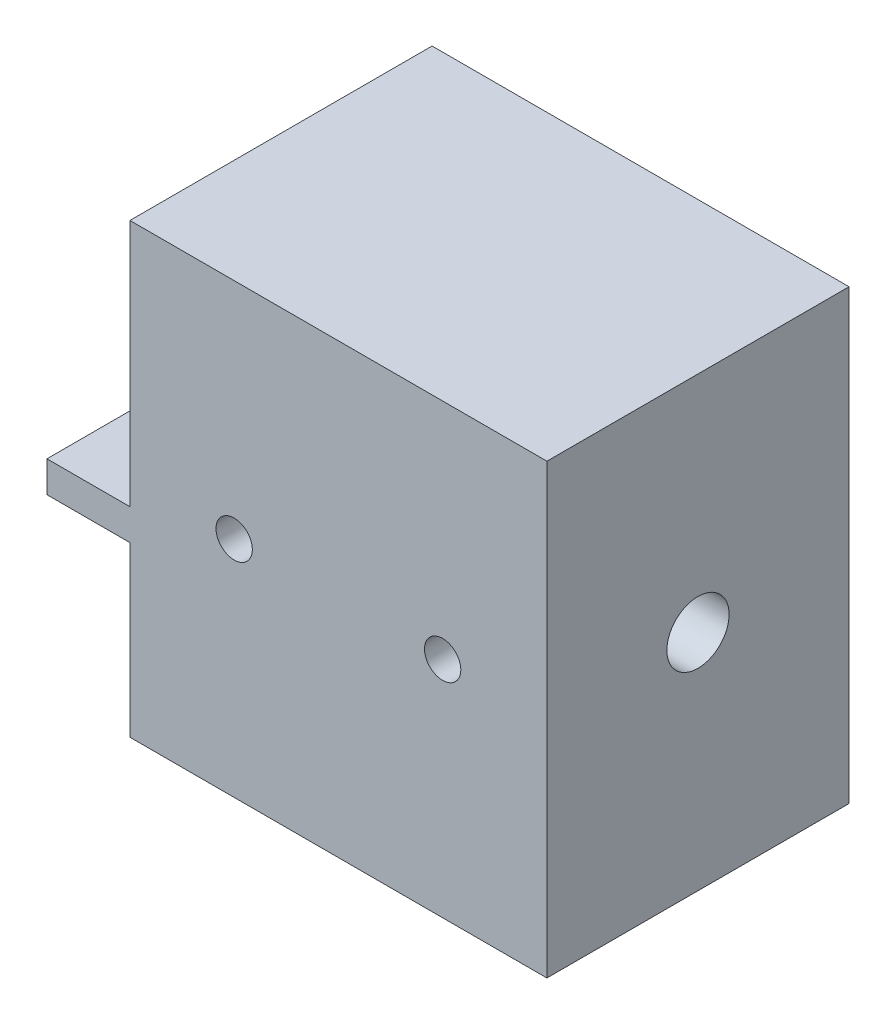
ISO-10303-21;
HEADER;
FILE_DESCRIPTION(('STEP AP214'),'2;1');
FILE_NAME('part.step','',(''),(''),'','','');
FILE_SCHEMA(('AUTOMOTIVE_DESIGN { 1 0 10303 214 1 1 1 1 }'));
ENDSEC;
DATA;
#1=APPLICATION_CONTEXT('core data for automotive mechanical design processes');
#2=APPLICATION_PROTOCOL_DEFINITION('international standard','automotive_design',2000,#1);
#3=PRODUCT_CONTEXT('',#1,'mechanical');
#4=PRODUCT('Part','Part','',(#3));
#5=PRODUCT_RELATED_PRODUCT_CATEGORY('part','',(#4));
#6=PRODUCT_DEFINITION_FORMATION('','',#4);
#7=PRODUCT_DEFINITION_CONTEXT('part definition',#1,'design');
#8=PRODUCT_DEFINITION('design','',#6,#7);
#9=PRODUCT_DEFINITION_SHAPE('','',#8);
#10=(LENGTH_UNIT() NAMED_UNIT(*) SI_UNIT(.MILLI.,.METRE.));
#11=(NAMED_UNIT(*) PLANE_ANGLE_UNIT() SI_UNIT($,.RADIAN.));
#12=(NAMED_UNIT(*) SI_UNIT($,.STERADIAN.) SOLID_ANGLE_UNIT());
#13=UNCERTAINTY_MEASURE_WITH_UNIT(LENGTH_MEASURE(1.E-05),#10,'distance_accuracy_value','');
#14=(GEOMETRIC_REPRESENTATION_CONTEXT(3) GLOBAL_UNCERTAINTY_ASSIGNED_CONTEXT((#13)) GLOBAL_UNIT_ASSIGNED_CONTEXT((#10,
#11,#12)) REPRESENTATION_CONTEXT('',''));
#15=CARTESIAN_POINT('',(0.,0.,0.));
#16=DIRECTION('',(0.,0.,1.));
#17=DIRECTION('',(1.,0.,0.));
#18=AXIS2_PLACEMENT_3D('',#15,#16,#17);
#19=CARTESIAN_POINT('',(-20.2513258729689,-3.79382158288662,40.));
#20=DIRECTION('',(0.,0.,-1.));
#21=DIRECTION('',(-1.,0.,0.));
#22=AXIS2_PLACEMENT_3D('',#19,#20,#21);
#23=CYLINDRICAL_SURFACE('',#22,1.75);
#24=CARTESIAN_POINT('',(-22.0013258729689,-3.79382158288662,17.565));
#25=CARTESIAN_POINT('',(-22.0013183626937,-3.70389548854153,17.5649933872255));
#26=CARTESIAN_POINT('',(-21.9943457467941,-3.61382268913705,17.5609117012381));
#27=CARTESIAN_POINT('',(-21.9667911022894,-3.43634397442441,17.5449664134664));
#28=CARTESIAN_POINT('',(-21.9461710140557,-3.34894623441761,17.5330810497795));
#29=CARTESIAN_POINT('',(-21.8924558415673,-3.17979643136016,17.5027406464476));
#30=CARTESIAN_POINT('',(-21.8594223363226,-3.09801881936906,17.4843180606085));
#31=CARTESIAN_POINT('',(-21.7821825678001,-2.94140825530694,17.4424937293754));
#32=CARTESIAN_POINT('',(-21.7379801197889,-2.86657294368377,17.4190936846924));
#33=CARTESIAN_POINT('',(-21.6359996827864,-2.71969163422893,17.3672756875161));
#34=CARTESIAN_POINT('',(-21.5774586617031,-2.6482628196938,17.3386144392163));
#35=CARTESIAN_POINT('',(-21.4501594531351,-2.51563430677802,17.2800516255849));
#36=CARTESIAN_POINT('',(-21.3813886115838,-2.45444747961298,17.2501485576482));
#37=CARTESIAN_POINT('',(-21.2262967337761,-2.33695802149655,17.1884392980714));
#38=CARTESIAN_POINT('',(-21.1388680239773,-2.2820145012298,17.1568066326621));
#39=CARTESIAN_POINT('',(-20.954164879168,-2.18782689232331,17.0995285160236));
#40=CARTESIAN_POINT('',(-20.8569061717603,-2.14855820768509,17.073873711244));
#41=CARTESIAN_POINT('',(-20.6781372003876,-2.09472359462168,17.0376236141756));
#42=CARTESIAN_POINT('',(-20.5981397467459,-2.07655565081224,17.0249229052408));
#43=CARTESIAN_POINT('',(-20.435581260063,-2.05161277481891,17.0073249974287));
#44=CARTESIAN_POINT('',(-20.3530232588854,-2.04482485581487,17.0024189037159));
#45=CARTESIAN_POINT('',(-20.1875797043464,-2.04302406953093,17.0011260357617));
#46=CARTESIAN_POINT('',(-20.1046938386221,-2.04802999095575,17.0047528552464));
#47=CARTESIAN_POINT('',(-19.9411678397311,-2.06954936453236,17.0200052736622));
#48=CARTESIAN_POINT('',(-19.8605293556819,-2.08607104709484,17.0316365934012));
#49=CARTESIAN_POINT('',(-19.7040809448141,-2.12961742036668,17.0612175952486));
#50=CARTESIAN_POINT('',(-19.6282398502999,-2.15656392084237,17.0791201483003));
#51=CARTESIAN_POINT('',(-19.4819334519636,-2.22000406830523,17.1193111884002));
#52=CARTESIAN_POINT('',(-19.4114701830917,-2.25650130634936,17.1416013243873));
#53=CARTESIAN_POINT('',(-19.2654667250514,-2.34501771576064,17.1925433945987));
#54=CARTESIAN_POINT('',(-19.1910328003616,-2.39860916799226,17.2216367408265));
#55=CARTESIAN_POINT('',(-19.0514767875005,-2.51662732207101,17.2803500964328));
#56=CARTESIAN_POINT('',(-18.9863631555545,-2.5810637496061,17.3099705570098));
#57=CARTESIAN_POINT('',(-18.8591420122246,-2.72848820539636,17.3707397511775));
#58=CARTESIAN_POINT('',(-18.7984089854912,-2.81278592986353,17.4016223828585));
#59=CARTESIAN_POINT('',(-18.6921941873567,-2.99228510060747,17.4574645083812));
#60=CARTESIAN_POINT('',(-18.6467032942154,-3.08747997948732,17.4824275422154));
#61=CARTESIAN_POINT('',(-18.5756733536579,-3.27957048061514,17.5221107689339));
#62=CARTESIAN_POINT('',(-18.5490006807076,-3.3759237159379,17.5374057010199));
#63=CARTESIAN_POINT('',(-18.5124720307535,-3.57274612460127,17.5584733765518));
#64=CARTESIAN_POINT('',(-18.5025980505962,-3.67321077330195,17.5642563137785));
#65=CARTESIAN_POINT('',(-18.5004306534122,-3.86153898687755,17.5655235952691));
#66=CARTESIAN_POINT('',(-18.5060593050292,-3.94937866575032,17.5622251989739));
#67=CARTESIAN_POINT('',(-18.5302705076321,-4.1226323922867,17.5481918220535));
#68=CARTESIAN_POINT('',(-18.5488531015192,-4.20804643191605,17.5374568167996));
#69=CARTESIAN_POINT('',(-18.5976931295868,-4.37285267497571,17.5097590850985));
#70=CARTESIAN_POINT('',(-18.6277619775221,-4.4523185608919,17.4928971606239));
#71=CARTESIAN_POINT('',(-18.698452563017,-4.60510237145512,17.4542974657267));
#72=CARTESIAN_POINT('',(-18.7390766399567,-4.6784189284409,17.4325586145653));
#73=CARTESIAN_POINT('',(-18.8344792536537,-4.8250721306599,17.3833525181235));
#74=CARTESIAN_POINT('',(-18.8902921633299,-4.89761332085752,17.355524289024));
#75=CARTESIAN_POINT('',(-19.0121404169972,-5.0328615325797,17.2981646699408));
#76=CARTESIAN_POINT('',(-19.0781876429376,-5.09555695070533,17.2686313256608));
#77=CARTESIAN_POINT('',(-19.227886433583,-5.21700189672075,17.2069174771264));
#78=CARTESIAN_POINT('',(-19.3126985709457,-5.27438432340992,17.1748424416357));
#79=CARTESIAN_POINT('',(-19.4923762338597,-5.37401570958307,17.1157551381831));
#80=CARTESIAN_POINT('',(-19.5872291749374,-5.41628332861077,17.0887366475998));
#81=CARTESIAN_POINT('',(-19.7635997704352,-5.47647872729611,17.0488837200922));
#82=CARTESIAN_POINT('',(-19.8435869804912,-5.49768864664623,17.0342474384314));
#83=CARTESIAN_POINT('',(-20.0067213412616,-5.52862404379347,17.0126165899701));
#84=CARTESIAN_POINT('',(-20.0898644273054,-5.53836380917637,17.0056125170641));
#85=CARTESIAN_POINT('',(-20.2572024805354,-5.54581956072869,17.0002675698696));
#86=CARTESIAN_POINT('',(-20.341399667315,-5.54350329863497,17.0019499305343));
#87=CARTESIAN_POINT('',(-20.5080197921451,-5.52691924033421,17.0137688322061));
#88=CARTESIAN_POINT('',(-20.5904416175361,-5.5126441606771,17.0239105253054));
#89=CARTESIAN_POINT('',(-20.7489065130706,-5.47351993257515,17.0507893341496));
#90=CARTESIAN_POINT('',(-20.8250658341734,-5.44899368585422,17.0673239766944));
#91=CARTESIAN_POINT('',(-20.9723253064089,-5.39036439758088,17.1051307925281));
#92=CARTESIAN_POINT('',(-21.0434235292089,-5.35625773000641,17.1264047589365));
#93=CARTESIAN_POINT('',(-21.1903034280437,-5.27334629678285,17.1752990399417));
#94=CARTESIAN_POINT('',(-21.2651039380693,-5.22308298443128,17.203391946195));
#95=CARTESIAN_POINT('',(-21.40593654458,-5.11193898700561,17.26064120997));
#96=CARTESIAN_POINT('',(-21.4719616971431,-5.05104998092453,17.2897983866669));
#97=CARTESIAN_POINT('',(-21.6028135990764,-4.9102688490897,17.3507153224179));
#98=CARTESIAN_POINT('',(-21.6661752534467,-4.82890939270424,17.3822670507882));
#99=CARTESIAN_POINT('',(-21.7783004603993,-4.65495943006557,17.4402129249764));
#100=CARTESIAN_POINT('',(-21.8270605884444,-4.56236629629008,17.4666058603848));
#101=CARTESIAN_POINT('',(-21.9058248845175,-4.3727258699512,17.5101375099232));
#102=CARTESIAN_POINT('',(-21.9366089901447,-4.2760981674327,17.5276557940663));
#103=CARTESIAN_POINT('',(-21.9699419473983,-4.12764789489271,17.5467893589844));
#104=CARTESIAN_POINT('',(-21.9789094958568,-4.07763805411014,17.551974732725));
#105=CARTESIAN_POINT('',(-21.992468354211,-3.97684473212933,17.5598360960392));
#106=CARTESIAN_POINT('',(-21.9970632722113,-3.9260619239706,17.5625141545109));
#107=CARTESIAN_POINT('',(-22.0006962291764,-3.84807785229347,17.5646329533989));
#108=CARTESIAN_POINT('',(-22.0013281391622,-3.82095639637275,17.5650019953764));
#109=CARTESIAN_POINT('',(-22.0013258729689,-3.79382158288662,17.565));
#110=B_SPLINE_CURVE_WITH_KNOTS('',3,(#24,#25,#26,#27,#28,#29,#30,#31,#32,#33,#34,#35,#36,#37,
#38,#39,#40,#41,#42,#43,#44,#45,#46,#47,#48,#49,#50,#51,#52,#53,#54,#55,#56,#57,#58,#59,#60,#61,
#62,#63,#64,#65,#66,#67,#68,#69,#70,#71,#72,#73,#74,#75,#76,#77,#78,#79,#80,#81,#82,#83,#84,#85,
#86,#87,#88,#89,#90,#91,#92,#93,#94,#95,#96,#97,#98,#99,#100,#101,#102,#103,#104,#105,#106,#107,
#108,#109),.UNSPECIFIED.,.T.,.F.,(4,2,2,2,2,2,2,2,2,2,2,2,2,2,2,2,2,2,2,2,2,2,2,2,2,2,2,2,2,2,2,
2,2,2,2,2,2,2,2,2,2,2,4),(0.,0.269682848507375,0.540120966746718,0.80923486744578,
1.07825696388483,1.36720562389127,1.65651472601918,1.97891442487774,2.30080622610211,
2.54877444581717,2.79645949249157,3.04453939165374,3.29279677764287,3.53922714819382,
3.78575030950588,4.07329505075291,4.36109904743875,4.6845988301423,5.00790466534685,
5.30952425878852,5.61082040251298,5.87376281934726,6.13670610700591,6.39550593899182,
6.65436317839365,6.94021883480414,7.22640888861097,7.54680260063234,7.86679940325803,
8.11784613873921,8.36857983060695,8.61998454570948,8.87154248884004,9.11571156496425,
9.35997317962994,9.64208079618313,9.92441033147707,10.246312237478,10.5682895810184,
10.8749947772205,11.0280026433254,11.1808841442313,11.26225978773),.UNSPECIFIED.);
#111=CARTESIAN_POINT('',(-22.0013258729689,-3.79382158288662,17.565));
#112=VERTEX_POINT('',#111);
#113=EDGE_CURVE('E36',#112,#112,#110,.T.);
#114=ORIENTED_EDGE('',*,*,#113,.T.);
#115=EDGE_LOOP('',(#114));
#116=FACE_BOUND('',#115,.T.);
#117=CARTESIAN_POINT('',(-20.2513258729689,-3.79382158288662,29.13));
#118=DIRECTION('',(0.,0.,1.));
#119=DIRECTION('',(1.,0.,0.));
#120=AXIS2_PLACEMENT_3D('',#117,#118,#119);
#121=CIRCLE('',#120,1.75);
#122=CARTESIAN_POINT('',(-18.5013258729689,-3.79382158288662,29.13));
#123=VERTEX_POINT('',#122);
#124=EDGE_CURVE('E206',#123,#123,#121,.T.);
#125=ORIENTED_EDGE('',*,*,#124,.T.);
#126=EDGE_LOOP('',(#125));
#127=FACE_BOUND('',#126,.T.);
#128=ADVANCED_FACE('F32',(#116,#127),#23,.F.);
#129=CARTESIAN_POINT('',(-50.4013258729689,17.7811784171134,29.13));
#130=DIRECTION('',(1.,0.,0.));
#131=DIRECTION('',(0.,0.,-1.));
#132=AXIS2_PLACEMENT_3D('',#129,#130,#131);
#133=PLANE('',#132);
#134=DIRECTION('',(0.,0.,1.));
#135=VECTOR('',#134,1.);
#136=CARTESIAN_POINT('',(-50.4013258729689,-9.11882158288662,29.13));
#137=LINE('',#136,#135);
#138=CARTESIAN_POINT('',(-50.4013258729689,-9.11882158288662,0.));
#139=VERTEX_POINT('',#138);
#140=CARTESIAN_POINT('',(-50.4013258729689,-9.11882158288662,29.13));
#141=VERTEX_POINT('',#140);
#142=EDGE_CURVE('E125',#139,#141,#137,.T.);
#143=ORIENTED_EDGE('',*,*,#142,.F.);
#144=DIRECTION('',(0.,-1.,0.));
#145=VECTOR('',#144,1.);
#146=CARTESIAN_POINT('',(-50.4013258729689,17.7811784171134,0.));
#147=LINE('',#146,#145);
#148=CARTESIAN_POINT('',(-50.4013258729689,-25.3688215828866,0.));
#149=VERTEX_POINT('',#148);
#150=EDGE_CURVE('E126',#139,#149,#147,.T.);
#151=ORIENTED_EDGE('',*,*,#150,.T.);
#152=DIRECTION('',(0.,0.,-1.));
#153=VECTOR('',#152,1.);
#154=CARTESIAN_POINT('',(-50.4013258729689,-25.3688215828866,29.13));
#155=LINE('',#154,#153);
#156=CARTESIAN_POINT('',(-50.4013258729689,-25.3688215828866,29.13));
#157=VERTEX_POINT('',#156);
#158=EDGE_CURVE('E11',#157,#149,#155,.T.);
#159=ORIENTED_EDGE('',*,*,#158,.F.);
#160=DIRECTION('',(0.,-1.,0.));
#161=VECTOR('',#160,1.);
#162=CARTESIAN_POINT('',(-50.4013258729689,17.7811784171134,29.13));
#163=LINE('',#162,#161);
#164=EDGE_CURVE('E53',#141,#157,#163,.T.);
#165=ORIENTED_EDGE('',*,*,#164,.F.);
#166=EDGE_LOOP('',(#143,#151,#159,#165));
#167=FACE_BOUND('',#166,.T.);
#168=ADVANCED_FACE('F34',(#167),#133,.F.);
#169=DIRECTION('',(0.,0.,-1.));
#170=VECTOR('',#169,1.);
#171=CARTESIAN_POINT('',(-50.4013258729689,-6.11882158288662,0.));
#172=LINE('',#171,#170);
#173=CARTESIAN_POINT('',(-50.4013258729689,-6.11882158288662,29.13));
#174=VERTEX_POINT('',#173);
#175=CARTESIAN_POINT('',(-50.4013258729689,-6.11882158288662,0.));
#176=VERTEX_POINT('',#175);
#177=EDGE_CURVE('E61',#174,#176,#172,.T.);
#178=ORIENTED_EDGE('',*,*,#177,.F.);
#179=CARTESIAN_POINT('',(-50.4013258729689,17.7811784171134,29.13));
#180=VERTEX_POINT('',#179);
#181=EDGE_CURVE('E134',#180,#174,#163,.T.);
#182=ORIENTED_EDGE('',*,*,#181,.F.);
#183=DIRECTION('',(0.,0.,-1.));
#184=VECTOR('',#183,1.);
#185=CARTESIAN_POINT('',(-50.4013258729689,17.7811784171134,29.13));
#186=LINE('',#185,#184);
#187=CARTESIAN_POINT('',(-50.4013258729689,17.7811784171134,0.));
#188=VERTEX_POINT('',#187);
#189=EDGE_CURVE('E141',#180,#188,#186,.T.);
#190=ORIENTED_EDGE('',*,*,#189,.T.);
#191=EDGE_CURVE('E128',#188,#176,#147,.T.);
#192=ORIENTED_EDGE('',*,*,#191,.T.);
#193=EDGE_LOOP('',(#178,#182,#190,#192));
#194=FACE_BOUND('',#193,.T.);
#195=ADVANCED_FACE('F189',(#194),#133,.F.);
#196=CARTESIAN_POINT('',(-50.4013258729689,-25.3688215828866,29.13));
#197=DIRECTION('',(0.,1.,0.));
#198=DIRECTION('',(0.,0.,1.));
#199=AXIS2_PLACEMENT_3D('',#196,#197,#198);
#200=PLANE('',#199);
#201=DIRECTION('',(1.,0.,0.));
#202=VECTOR('',#201,1.);
#203=CARTESIAN_POINT('',(-50.4013258729689,-25.3688215828866,0.));
#204=LINE('',#203,#202);
#205=CARTESIAN_POINT('',(-10.2013258729689,-25.3688215828866,0.));
#206=VERTEX_POINT('',#205);
#207=EDGE_CURVE('E143',#149,#206,#204,.T.);
#208=ORIENTED_EDGE('',*,*,#207,.T.);
#209=DIRECTION('',(0.,0.,-1.));
#210=VECTOR('',#209,1.);
#211=CARTESIAN_POINT('',(-10.2013258729689,-25.3688215828866,29.13));
#212=LINE('',#211,#210);
#213=CARTESIAN_POINT('',(-10.2013258729689,-25.3688215828866,29.13));
#214=VERTEX_POINT('',#213);
#215=EDGE_CURVE('E45',#214,#206,#212,.T.);
#216=ORIENTED_EDGE('',*,*,#215,.F.);
#217=DIRECTION('',(1.,0.,0.));
#218=VECTOR('',#217,1.);
#219=CARTESIAN_POINT('',(-50.4013258729689,-25.3688215828866,29.13));
#220=LINE('',#219,#218);
#221=EDGE_CURVE('E136',#157,#214,#220,.T.);
#222=ORIENTED_EDGE('',*,*,#221,.F.);
#223=ORIENTED_EDGE('',*,*,#158,.T.);
#224=EDGE_LOOP('',(#208,#216,#222,#223));
#225=FACE_BOUND('',#224,.T.);
#226=ADVANCED_FACE('F262',(#225),#200,.F.);
#227=CARTESIAN_POINT('',(-10.2013258729689,17.7811784171134,29.13));
#228=DIRECTION('',(-1.,0.,0.));
#229=DIRECTION('',(0.,0.,1.));
#230=AXIS2_PLACEMENT_3D('',#227,#228,#229);
#231=PLANE('',#230);
#232=CARTESIAN_POINT('',(-10.2013258729689,-3.79382158288662,14.565));
#233=DIRECTION('',(1.,0.,0.));
#234=DIRECTION('',(0.,0.,-1.));
#235=AXIS2_PLACEMENT_3D('',#232,#233,#234);
#236=CIRCLE('',#235,3.);
#237=CARTESIAN_POINT('',(-10.2013258729689,-3.79382158288662,11.565));
#238=VERTEX_POINT('',#237);
#239=EDGE_CURVE('E212',#238,#238,#236,.T.);
#240=ORIENTED_EDGE('',*,*,#239,.F.);
#241=EDGE_LOOP('',(#240));
#242=FACE_BOUND('',#241,.T.);
#243=DIRECTION('',(0.,1.,0.));
#244=VECTOR('',#243,1.);
#245=CARTESIAN_POINT('',(-10.2013258729689,17.7811784171134,0.));
#246=LINE('',#245,#244);
#247=CARTESIAN_POINT('',(-10.2013258729689,17.7811784171134,0.));
#248=VERTEX_POINT('',#247);
#249=EDGE_CURVE('E145',#206,#248,#246,.T.);
#250=ORIENTED_EDGE('',*,*,#249,.T.);
#251=DIRECTION('',(0.,0.,-1.));
#252=VECTOR('',#251,1.);
#253=CARTESIAN_POINT('',(-10.2013258729689,17.7811784171134,29.13));
#254=LINE('',#253,#252);
#255=CARTESIAN_POINT('',(-10.2013258729689,17.7811784171134,29.13));
#256=VERTEX_POINT('',#255);
#257=EDGE_CURVE('E151',#256,#248,#254,.T.);
#258=ORIENTED_EDGE('',*,*,#257,.F.);
#259=DIRECTION('',(0.,1.,0.));
#260=VECTOR('',#259,1.);
#261=CARTESIAN_POINT('',(-10.2013258729689,17.7811784171134,29.13));
#262=LINE('',#261,#260);
#263=EDGE_CURVE('E138',#214,#256,#262,.T.);
#264=ORIENTED_EDGE('',*,*,#263,.F.);
#265=ORIENTED_EDGE('',*,*,#215,.T.);
#266=EDGE_LOOP('',(#250,#258,#264,#265));
#267=FACE_BOUND('',#266,.T.);
#268=ADVANCED_FACE('F259',(#242,#267),#231,.F.);
#269=CARTESIAN_POINT('',(-50.4013258729689,17.7811784171134,29.13));
#270=DIRECTION('',(0.,-1.,0.));
#271=DIRECTION('',(0.,0.,-1.));
#272=AXIS2_PLACEMENT_3D('',#269,#270,#271);
#273=PLANE('',#272);
#274=DIRECTION('',(-1.,0.,0.));
#275=VECTOR('',#274,1.);
#276=CARTESIAN_POINT('',(-50.4013258729689,17.7811784171134,0.));
#277=LINE('',#276,#275);
#278=EDGE_CURVE('E147',#248,#188,#277,.T.);
#279=ORIENTED_EDGE('',*,*,#278,.T.);
#280=ORIENTED_EDGE('',*,*,#189,.F.);
#281=DIRECTION('',(-1.,0.,0.));
#282=VECTOR('',#281,1.);
#283=CARTESIAN_POINT('',(-50.4013258729689,17.7811784171134,29.13));
#284=LINE('',#283,#282);
#285=EDGE_CURVE('E140',#256,#180,#284,.T.);
#286=ORIENTED_EDGE('',*,*,#285,.F.);
#287=ORIENTED_EDGE('',*,*,#257,.T.);
#288=EDGE_LOOP('',(#279,#280,#286,#287));
#289=FACE_BOUND('',#288,.T.);
#290=ADVANCED_FACE('F253',(#289),#273,.F.);
#291=CARTESIAN_POINT('',(0.,0.,29.13));
#292=DIRECTION('',(0.,0.,1.));
#293=DIRECTION('',(1.,0.,0.));
#294=AXIS2_PLACEMENT_3D('',#291,#292,#293);
#295=PLANE('',#294);
#296=ORIENTED_EDGE('',*,*,#124,.F.);
#297=EDGE_LOOP('',(#296));
#298=FACE_BOUND('',#297,.T.);
#299=CARTESIAN_POINT('',(-40.3513258729689,-3.79382158288662,29.13));
#300=DIRECTION('',(0.,0.,1.));
#301=DIRECTION('',(1.,0.,0.));
#302=AXIS2_PLACEMENT_3D('',#299,#300,#301);
#303=CIRCLE('',#302,1.75);
#304=CARTESIAN_POINT('',(-38.6013258729689,-3.79382158288662,29.13));
#305=VERTEX_POINT('',#304);
#306=EDGE_CURVE('E163',#305,#305,#303,.T.);
#307=ORIENTED_EDGE('',*,*,#306,.F.);
#308=EDGE_LOOP('',(#307));
#309=FACE_BOUND('',#308,.T.);
#310=ORIENTED_EDGE('',*,*,#181,.T.);
#311=DIRECTION('',(1.,0.,0.));
#312=VECTOR('',#311,1.);
#313=CARTESIAN_POINT('',(-58.4013258729689,-6.11882158288662,29.13));
#314=LINE('',#313,#312);
#315=CARTESIAN_POINT('',(-58.4013258729689,-6.11882158288662,29.13));
#316=VERTEX_POINT('',#315);
#317=EDGE_CURVE('E110',#316,#174,#314,.T.);
#318=ORIENTED_EDGE('',*,*,#317,.F.);
#319=DIRECTION('',(0.,1.,0.));
#320=VECTOR('',#319,1.);
#321=CARTESIAN_POINT('',(-58.4013258729689,-6.11882158288662,29.13));
#322=LINE('',#321,#320);
#323=CARTESIAN_POINT('',(-58.4013258729689,-9.11882158288662,29.13));
#324=VERTEX_POINT('',#323);
#325=EDGE_CURVE('E103',#324,#316,#322,.T.);
#326=ORIENTED_EDGE('',*,*,#325,.F.);
#327=DIRECTION('',(1.,0.,0.));
#328=VECTOR('',#327,1.);
#329=CARTESIAN_POINT('',(-58.4013258729689,-9.11882158288662,29.13));
#330=LINE('',#329,#328);
#331=EDGE_CURVE('E107',#324,#141,#330,.T.);
#332=ORIENTED_EDGE('',*,*,#331,.T.);
#333=ORIENTED_EDGE('',*,*,#164,.T.);
#334=ORIENTED_EDGE('',*,*,#221,.T.);
#335=ORIENTED_EDGE('',*,*,#263,.T.);
#336=ORIENTED_EDGE('',*,*,#285,.T.);
#337=EDGE_LOOP('',(#310,#318,#326,#332,#333,#334,#335,#336));
#338=FACE_BOUND('',#337,.T.);
#339=ADVANCED_FACE('F105',(#298,#309,#338),#295,.T.);
#340=CARTESIAN_POINT('',(0.,0.,0.));
#341=DIRECTION('',(0.,0.,1.));
#342=DIRECTION('',(1.,0.,0.));
#343=AXIS2_PLACEMENT_3D('',#340,#341,#342);
#344=PLANE('',#343);
#345=CARTESIAN_POINT('',(-20.2513258729689,-3.79382158288662,0.));
#346=DIRECTION('',(0.,0.,-1.));
#347=DIRECTION('',(-1.,0.,0.));
#348=AXIS2_PLACEMENT_3D('',#345,#346,#347);
#349=CIRCLE('',#348,1.75);
#350=CARTESIAN_POINT('',(-22.0013258729689,-3.79382158288662,0.));
#351=VERTEX_POINT('',#350);
#352=EDGE_CURVE('E204',#351,#351,#349,.T.);
#353=ORIENTED_EDGE('',*,*,#352,.F.);
#354=EDGE_LOOP('',(#353));
#355=FACE_BOUND('',#354,.T.);
#356=CARTESIAN_POINT('',(-40.3513258729689,-3.79382158288662,0.));
#357=DIRECTION('',(0.,0.,-1.));
#358=DIRECTION('',(-1.,0.,0.));
#359=AXIS2_PLACEMENT_3D('',#356,#357,#358);
#360=CIRCLE('',#359,1.75);
#361=CARTESIAN_POINT('',(-42.1013258729689,-3.79382158288662,0.));
#362=VERTEX_POINT('',#361);
#363=EDGE_CURVE('E209',#362,#362,#360,.T.);
#364=ORIENTED_EDGE('',*,*,#363,.F.);
#365=EDGE_LOOP('',(#364));
#366=FACE_BOUND('',#365,.T.);
#367=ORIENTED_EDGE('',*,*,#191,.F.);
#368=ORIENTED_EDGE('',*,*,#278,.F.);
#369=ORIENTED_EDGE('',*,*,#249,.F.);
#370=ORIENTED_EDGE('',*,*,#207,.F.);
#371=ORIENTED_EDGE('',*,*,#150,.F.);
#372=DIRECTION('',(1.,0.,0.));
#373=VECTOR('',#372,1.);
#374=CARTESIAN_POINT('',(-58.4013258729689,-9.11882158288662,0.));
#375=LINE('',#374,#373);
#376=CARTESIAN_POINT('',(-58.4013258729689,-9.11882158288662,0.));
#377=VERTEX_POINT('',#376);
#378=EDGE_CURVE('E225',#377,#139,#375,.T.);
#379=ORIENTED_EDGE('',*,*,#378,.F.);
#380=DIRECTION('',(0.,-1.,0.));
#381=VECTOR('',#380,1.);
#382=CARTESIAN_POINT('',(-58.4013258729689,-9.11882158288662,0.));
#383=LINE('',#382,#381);
#384=CARTESIAN_POINT('',(-58.4013258729689,-6.11882158288662,0.));
#385=VERTEX_POINT('',#384);
#386=EDGE_CURVE('E119',#385,#377,#383,.T.);
#387=ORIENTED_EDGE('',*,*,#386,.F.);
#388=DIRECTION('',(1.,0.,0.));
#389=VECTOR('',#388,1.);
#390=CARTESIAN_POINT('',(-58.4013258729689,-6.11882158288662,0.));
#391=LINE('',#390,#389);
#392=EDGE_CURVE('E130',#385,#176,#391,.T.);
#393=ORIENTED_EDGE('',*,*,#392,.T.);
#394=EDGE_LOOP('',(#367,#368,#369,#370,#371,#379,#387,#393));
#395=FACE_BOUND('',#394,.T.);
#396=ADVANCED_FACE('F232',(#355,#366,#395),#344,.F.);
#397=CARTESIAN_POINT('',(-58.4013258729689,-9.11882158288662,29.13));
#398=DIRECTION('',(0.,1.,0.));
#399=DIRECTION('',(0.,0.,1.));
#400=AXIS2_PLACEMENT_3D('',#397,#398,#399);
#401=PLANE('',#400);
#402=CARTESIAN_POINT('',(-53.6013258862413,-9.11882158288662,19.725));
#403=DIRECTION('',(0.,1.,0.));
#404=DIRECTION('',(0.,0.,1.));
#405=AXIS2_PLACEMENT_3D('',#402,#403,#404);
#406=CIRCLE('',#405,1.75);
#407=CARTESIAN_POINT('',(-53.6013258862413,-9.11882158288662,21.475));
#408=VERTEX_POINT('',#407);
#409=EDGE_CURVE('E160',#408,#408,#406,.F.);
#410=ORIENTED_EDGE('',*,*,#409,.F.);
#411=EDGE_LOOP('',(#410));
#412=FACE_BOUND('',#411,.T.);
#413=CARTESIAN_POINT('',(-53.6013258862413,-9.11882158288662,9.37500000000001));
#414=DIRECTION('',(0.,1.,0.));
#415=DIRECTION('',(0.,0.,1.));
#416=AXIS2_PLACEMENT_3D('',#413,#414,#415);
#417=CIRCLE('',#416,1.75);
#418=CARTESIAN_POINT('',(-53.6013258862413,-9.11882158288662,11.125));
#419=VERTEX_POINT('',#418);
#420=EDGE_CURVE('E159',#419,#419,#417,.F.);
#421=ORIENTED_EDGE('',*,*,#420,.F.);
#422=EDGE_LOOP('',(#421));
#423=FACE_BOUND('',#422,.T.);
#424=ORIENTED_EDGE('',*,*,#142,.T.);
#425=ORIENTED_EDGE('',*,*,#331,.F.);
#426=DIRECTION('',(0.,0.,1.));
#427=VECTOR('',#426,1.);
#428=CARTESIAN_POINT('',(-58.4013258729689,-9.11882158288662,29.13));
#429=LINE('',#428,#427);
#430=EDGE_CURVE('E114',#377,#324,#429,.T.);
#431=ORIENTED_EDGE('',*,*,#430,.F.);
#432=ORIENTED_EDGE('',*,*,#378,.T.);
#433=EDGE_LOOP('',(#424,#425,#431,#432));
#434=FACE_BOUND('',#433,.T.);
#435=ADVANCED_FACE('F124',(#412,#423,#434),#401,.F.);
#436=CARTESIAN_POINT('',(-58.4013258729689,-6.11882158288662,0.));
#437=DIRECTION('',(0.,-1.,0.));
#438=DIRECTION('',(0.,0.,-1.));
#439=AXIS2_PLACEMENT_3D('',#436,#437,#438);
#440=PLANE('',#439);
#441=CARTESIAN_POINT('',(-53.6013258862413,-6.11882158288662,19.725));
#442=DIRECTION('',(0.,-1.,0.));
#443=DIRECTION('',(0.,0.,-1.));
#444=AXIS2_PLACEMENT_3D('',#441,#442,#443);
#445=CIRCLE('',#444,1.75);
#446=CARTESIAN_POINT('',(-53.6013258862413,-6.11882158288662,17.975));
#447=VERTEX_POINT('',#446);
#448=EDGE_CURVE('E161',#447,#447,#445,.F.);
#449=ORIENTED_EDGE('',*,*,#448,.F.);
#450=EDGE_LOOP('',(#449));
#451=FACE_BOUND('',#450,.T.);
#452=CARTESIAN_POINT('',(-53.6013258862413,-6.11882158288662,9.37500000000001));
#453=DIRECTION('',(0.,-1.,0.));
#454=DIRECTION('',(0.,0.,-1.));
#455=AXIS2_PLACEMENT_3D('',#452,#453,#454);
#456=CIRCLE('',#455,1.75);
#457=CARTESIAN_POINT('',(-53.6013258862413,-6.11882158288662,7.625));
#458=VERTEX_POINT('',#457);
#459=EDGE_CURVE('E156',#458,#458,#456,.F.);
#460=ORIENTED_EDGE('',*,*,#459,.F.);
#461=EDGE_LOOP('',(#460));
#462=FACE_BOUND('',#461,.T.);
#463=ORIENTED_EDGE('',*,*,#177,.T.);
#464=ORIENTED_EDGE('',*,*,#392,.F.);
#465=DIRECTION('',(0.,0.,-1.));
#466=VECTOR('',#465,1.);
#467=CARTESIAN_POINT('',(-58.4013258729689,-6.11882158288662,0.));
#468=LINE('',#467,#466);
#469=EDGE_CURVE('E113',#316,#385,#468,.T.);
#470=ORIENTED_EDGE('',*,*,#469,.F.);
#471=ORIENTED_EDGE('',*,*,#317,.T.);
#472=EDGE_LOOP('',(#463,#464,#470,#471));
#473=FACE_BOUND('',#472,.T.);
#474=ADVANCED_FACE('F235',(#451,#462,#473),#440,.F.);
#475=CARTESIAN_POINT('',(-58.4013258729689,0.,0.));
#476=DIRECTION('',(1.,0.,0.));
#477=DIRECTION('',(0.,0.,-1.));
#478=AXIS2_PLACEMENT_3D('',#475,#476,#477);
#479=PLANE('',#478);
#480=ORIENTED_EDGE('',*,*,#430,.T.);
#481=ORIENTED_EDGE('',*,*,#325,.T.);
#482=ORIENTED_EDGE('',*,*,#469,.T.);
#483=ORIENTED_EDGE('',*,*,#386,.T.);
#484=EDGE_LOOP('',(#480,#481,#482,#483));
#485=FACE_BOUND('',#484,.T.);
#486=ADVANCED_FACE('F117',(#485),#479,.F.);
#487=CARTESIAN_POINT('',(-53.6013258862413,-1.11882158288662,9.37500000000001));
#488=DIRECTION('',(0.,-1.,0.));
#489=DIRECTION('',(0.,0.,-1.));
#490=AXIS2_PLACEMENT_3D('',#487,#488,#489);
#491=CYLINDRICAL_SURFACE('',#490,1.75);
#492=ORIENTED_EDGE('',*,*,#459,.T.);
#493=EDGE_LOOP('',(#492));
#494=FACE_BOUND('',#493,.T.);
#495=ORIENTED_EDGE('',*,*,#420,.T.);
#496=EDGE_LOOP('',(#495));
#497=FACE_BOUND('',#496,.T.);
#498=ADVANCED_FACE('F243',(#494,#497),#491,.F.);
#499=CARTESIAN_POINT('',(-53.6013258862413,-1.11882158288662,19.725));
#500=DIRECTION('',(0.,-1.,0.));
#501=DIRECTION('',(0.,0.,-1.));
#502=AXIS2_PLACEMENT_3D('',#499,#500,#501);
#503=CYLINDRICAL_SURFACE('',#502,1.75);
#504=ORIENTED_EDGE('',*,*,#448,.T.);
#505=EDGE_LOOP('',(#504));
#506=FACE_BOUND('',#505,.T.);
#507=ORIENTED_EDGE('',*,*,#409,.T.);
#508=EDGE_LOOP('',(#507));
#509=FACE_BOUND('',#508,.T.);
#510=ADVANCED_FACE('F198',(#506,#509),#503,.F.);
#511=CARTESIAN_POINT('',(-40.3513258729689,-3.79382158288662,40.));
#512=DIRECTION('',(0.,0.,-1.));
#513=DIRECTION('',(-1.,0.,0.));
#514=AXIS2_PLACEMENT_3D('',#511,#512,#513);
#515=CYLINDRICAL_SURFACE('',#514,1.75);
#516=ORIENTED_EDGE('',*,*,#306,.T.);
#517=EDGE_LOOP('',(#516));
#518=FACE_BOUND('',#517,.T.);
#519=ORIENTED_EDGE('',*,*,#363,.T.);
#520=EDGE_LOOP('',(#519));
#521=FACE_BOUND('',#520,.T.);
#522=ADVANCED_FACE('F193',(#518,#521),#515,.F.);
#523=CARTESIAN_POINT('',(-22.0013258729689,-3.79382158288662,11.565));
#524=CARTESIAN_POINT('',(-22.0013183626937,-3.8837476772317,11.5650066127745));
#525=CARTESIAN_POINT('',(-21.9943457467941,-3.97382047663619,11.5690882987619));
#526=CARTESIAN_POINT('',(-21.9667911022894,-4.15129919134883,11.5850335865336));
#527=CARTESIAN_POINT('',(-21.9461710140557,-4.23869693135563,11.5969189502205));
#528=CARTESIAN_POINT('',(-21.8924558415673,-4.40784673441308,11.6272593535524));
#529=CARTESIAN_POINT('',(-21.8594223363226,-4.48962434640417,11.6456819393915));
#530=CARTESIAN_POINT('',(-21.7821825678001,-4.6462349104663,11.6875062706247));
#531=CARTESIAN_POINT('',(-21.7379801197889,-4.72107022208947,11.7109063153076));
#532=CARTESIAN_POINT('',(-21.6359996827864,-4.86795153154431,11.7627243124839));
#533=CARTESIAN_POINT('',(-21.5774586617031,-4.93938034607944,11.7913855607837));
#534=CARTESIAN_POINT('',(-21.4501594531351,-5.07200885899521,11.8499483744151));
#535=CARTESIAN_POINT('',(-21.3813886115838,-5.13319568616025,11.8798514423518));
#536=CARTESIAN_POINT('',(-21.2262967337761,-5.25068514427668,11.9415607019286));
#537=CARTESIAN_POINT('',(-21.1388680239773,-5.30562866454344,11.9731933673379));
#538=CARTESIAN_POINT('',(-20.954164879168,-5.39981627344992,12.0304714839764));
#539=CARTESIAN_POINT('',(-20.8569061717603,-5.43908495808815,12.056126288756));
#540=CARTESIAN_POINT('',(-20.6781372003876,-5.49291957115156,12.0923763858244));
#541=CARTESIAN_POINT('',(-20.5981397467459,-5.51108751496099,12.1050770947592));
#542=CARTESIAN_POINT('',(-20.435581260063,-5.53603039095433,12.1226750025713));
#543=CARTESIAN_POINT('',(-20.3530232588854,-5.54281830995837,12.1275810962841));
#544=CARTESIAN_POINT('',(-20.1875797043464,-5.54461909624231,12.1288739642384));
#545=CARTESIAN_POINT('',(-20.1046938386221,-5.53961317481748,12.1252471447536));
#546=CARTESIAN_POINT('',(-19.9411678397311,-5.51809380124088,12.1099947263378));
#547=CARTESIAN_POINT('',(-19.8605293556819,-5.5015721186784,12.0983634065988));
#548=CARTESIAN_POINT('',(-19.7040809448141,-5.45802574540655,12.0687824047514));
#549=CARTESIAN_POINT('',(-19.6282398502999,-5.43107924493087,12.0508798516997));
#550=CARTESIAN_POINT('',(-19.4819334519636,-5.36763909746801,12.0106888115998));
#551=CARTESIAN_POINT('',(-19.4114701830917,-5.33114185942387,11.9883986756127));
#552=CARTESIAN_POINT('',(-19.2654667250514,-5.2426254500126,11.9374566054013));
#553=CARTESIAN_POINT('',(-19.1910328003616,-5.18903399778098,11.9083632591736));
#554=CARTESIAN_POINT('',(-19.0514767875005,-5.07101584370223,11.8496499035672));
#555=CARTESIAN_POINT('',(-18.9863631555545,-5.00657941616713,11.8200294429902));
#556=CARTESIAN_POINT('',(-18.8591420122246,-4.85915496037688,11.7592602488225));
#557=CARTESIAN_POINT('',(-18.7984089854912,-4.7748572359097,11.7283776171415));
#558=CARTESIAN_POINT('',(-18.6921941873567,-4.59535806516576,11.6725354916188));
#559=CARTESIAN_POINT('',(-18.6467032942154,-4.50016318628591,11.6475724577846));
#560=CARTESIAN_POINT('',(-18.5756733536579,-4.3080726851581,11.6078892310661));
#561=CARTESIAN_POINT('',(-18.5490006807076,-4.21171944983533,11.5925942989801));
#562=CARTESIAN_POINT('',(-18.5124720307535,-4.01489704117197,11.5715266234482));
#563=CARTESIAN_POINT('',(-18.5025980505962,-3.91443239247129,11.5657436862215));
#564=CARTESIAN_POINT('',(-18.5004306534122,-3.72610417889569,11.5644764047309));
#565=CARTESIAN_POINT('',(-18.5060593050292,-3.63826450002292,11.5677748010261));
#566=CARTESIAN_POINT('',(-18.5302705076321,-3.46501077348653,11.5818081779465));
#567=CARTESIAN_POINT('',(-18.5488531015192,-3.37959673385719,11.5925431832004));
#568=CARTESIAN_POINT('',(-18.5976931295868,-3.21479049079753,11.6202409149015));
#569=CARTESIAN_POINT('',(-18.6277619775221,-3.13532460488134,11.6371028393761));
#570=CARTESIAN_POINT('',(-18.698452563017,-2.98254079431811,11.6757025342734));
#571=CARTESIAN_POINT('',(-18.7390766399567,-2.90922423733233,11.6974413854347));
#572=CARTESIAN_POINT('',(-18.8344792536537,-2.76257103511334,11.7466474818765));
#573=CARTESIAN_POINT('',(-18.8902921633299,-2.69002984491572,11.774475710976));
#574=CARTESIAN_POINT('',(-19.0121404169972,-2.55478163319354,11.8318353300592));
#575=CARTESIAN_POINT('',(-19.0781876429376,-2.4920862150679,11.8613686743392));
#576=CARTESIAN_POINT('',(-19.227886433583,-2.37064126905249,11.9230825228736));
#577=CARTESIAN_POINT('',(-19.3126985709457,-2.31325884236332,11.9551575583643));
#578=CARTESIAN_POINT('',(-19.4923762338597,-2.21362745619017,12.0142448618169));
#579=CARTESIAN_POINT('',(-19.5872291749374,-2.17135983716246,12.0412633524002));
#580=CARTESIAN_POINT('',(-19.7635997704352,-2.11116443847712,12.0811162799078));
#581=CARTESIAN_POINT('',(-19.8435869804912,-2.089954519127,12.0957525615686));
#582=CARTESIAN_POINT('',(-20.0067213412616,-2.05901912197977,12.1173834100299));
#583=CARTESIAN_POINT('',(-20.0898644273054,-2.04927935659687,12.1243874829359));
#584=CARTESIAN_POINT('',(-20.2572024805355,-2.04182360504455,12.1297324301304));
#585=CARTESIAN_POINT('',(-20.341399667315,-2.04413986713827,12.1280500694657));
#586=CARTESIAN_POINT('',(-20.5080197921451,-2.06072392543903,12.1162311677939));
#587=CARTESIAN_POINT('',(-20.5904416175361,-2.07499900509614,12.1060894746946));
#588=CARTESIAN_POINT('',(-20.7489065130706,-2.11412323319809,12.0792106658504));
#589=CARTESIAN_POINT('',(-20.8250658341734,-2.13864947991902,12.0626760233056));
#590=CARTESIAN_POINT('',(-20.9723253064089,-2.19727876819236,12.0248692074719));
#591=CARTESIAN_POINT('',(-21.0434235292089,-2.23138543576683,12.0035952410635));
#592=CARTESIAN_POINT('',(-21.1903034280437,-2.31429686899039,11.9547009600583));
#593=CARTESIAN_POINT('',(-21.2651039380693,-2.36456018134196,11.926608053805));
#594=CARTESIAN_POINT('',(-21.40593654458,-2.47570417876763,11.86935879003));
#595=CARTESIAN_POINT('',(-21.4719616971431,-2.53659318484871,11.8402016133331));
#596=CARTESIAN_POINT('',(-21.6028135990764,-2.67737431668354,11.7792846775821));
#597=CARTESIAN_POINT('',(-21.6661752534467,-2.758733773069,11.7477329492118));
#598=CARTESIAN_POINT('',(-21.7783004603993,-2.93268373570766,11.6897870750236));
#599=CARTESIAN_POINT('',(-21.8270605884444,-3.02527686948316,11.6633941396152));
#600=CARTESIAN_POINT('',(-21.9058248845175,-3.21491729582205,11.6198624900768));
#601=CARTESIAN_POINT('',(-21.9366089901447,-3.31154499834055,11.6023442059337));
#602=CARTESIAN_POINT('',(-21.9699419473983,-3.45999527088053,11.5832106410156));
#603=CARTESIAN_POINT('',(-21.9789094958568,-3.51000511166311,11.578025267275));
#604=CARTESIAN_POINT('',(-21.992468354211,-3.61079843364391,11.5701639039608));
#605=CARTESIAN_POINT('',(-21.9970632722113,-3.66158124180264,11.5674858454891));
#606=CARTESIAN_POINT('',(-22.0006962291764,-3.73956531347978,11.5653670466011));
#607=CARTESIAN_POINT('',(-22.0013281391622,-3.76668676940049,11.5649980046236));
#608=CARTESIAN_POINT('',(-22.0013258729689,-3.79382158288662,11.565));
#609=B_SPLINE_CURVE_WITH_KNOTS('',3,(#523,#524,#525,#526,#527,#528,#529,#530,#531,#532,#533,
#534,#535,#536,#537,#538,#539,#540,#541,#542,#543,#544,#545,#546,#547,#548,#549,#550,#551,#552,
#553,#554,#555,#556,#557,#558,#559,#560,#561,#562,#563,#564,#565,#566,#567,#568,#569,#570,#571,
#572,#573,#574,#575,#576,#577,#578,#579,#580,#581,#582,#583,#584,#585,#586,#587,#588,#589,#590,
#591,#592,#593,#594,#595,#596,#597,#598,#599,#600,#601,#602,#603,#604,#605,#606,#607,#608),
.UNSPECIFIED.,.T.,.F.,(4,2,2,2,2,2,2,2,2,2,2,2,2,2,2,2,2,2,2,2,2,2,2,2,2,2,2,2,2,2,2,2,2,2,2,2,
2,2,2,2,2,2,4),(0.,0.269682848507375,0.540120966746717,0.80923486744578,1.07825696388483,
1.36720562389127,1.65651472601918,1.97891442487773,2.3008062261021,2.54877444581717,
2.79645949249157,3.04453939165374,3.29279677764287,3.53922714819382,3.78575030950588,
4.07329505075292,4.36109904743875,4.6845988301423,5.00790466534685,5.30952425878852,
5.61082040251298,5.87376281934726,6.1367061070059,6.39550593899182,6.65436317839365,
6.94021883480414,7.22640888861097,7.54680260063235,7.86679940325803,8.11784613873922,
8.36857983060695,8.61998454570948,8.87154248884004,9.11571156496425,9.35997317962993,
9.64208079618313,9.92441033147707,10.246312237478,10.5682895810184,10.8749947772205,
11.0280026433254,11.1808841442313,11.26225978773),.UNSPECIFIED.);
#610=CARTESIAN_POINT('',(-22.0013258729689,-3.79382158288662,11.565));
#611=VERTEX_POINT('',#610);
#612=EDGE_CURVE('E164',#611,#611,#609,.T.);
#613=ORIENTED_EDGE('',*,*,#612,.T.);
#614=EDGE_LOOP('',(#613));
#615=FACE_BOUND('',#614,.T.);
#616=ORIENTED_EDGE('',*,*,#352,.T.);
#617=EDGE_LOOP('',(#616));
#618=FACE_BOUND('',#617,.T.);
#619=ADVANCED_FACE('F169',(#615,#618),#23,.F.);
#620=CARTESIAN_POINT('',(-28.2013258729689,-3.79382158288662,14.565));
#621=DIRECTION('',(1.,0.,0.));
#622=DIRECTION('',(0.,0.,-1.));
#623=AXIS2_PLACEMENT_3D('',#620,#621,#622);
#624=CYLINDRICAL_SURFACE('',#623,3.);
#625=ORIENTED_EDGE('',*,*,#612,.F.);
#626=EDGE_LOOP('',(#625));
#627=FACE_BOUND('',#626,.T.);
#628=CARTESIAN_POINT('',(-28.2013258729689,-3.79382158288662,14.565));
#629=DIRECTION('',(1.,0.,0.));
#630=DIRECTION('',(0.,0.,-1.));
#631=AXIS2_PLACEMENT_3D('',#628,#629,#630);
#632=CIRCLE('',#631,3.);
#633=CARTESIAN_POINT('',(-28.2013258729689,-3.79382158288662,11.565));
#634=VERTEX_POINT('',#633);
#635=EDGE_CURVE('E168',#634,#634,#632,.T.);
#636=ORIENTED_EDGE('',*,*,#635,.F.);
#637=EDGE_LOOP('',(#636));
#638=FACE_BOUND('',#637,.T.);
#639=ORIENTED_EDGE('',*,*,#239,.T.);
#640=EDGE_LOOP('',(#639));
#641=FACE_BOUND('',#640,.T.);
#642=ORIENTED_EDGE('',*,*,#113,.F.);
#643=EDGE_LOOP('',(#642));
#644=FACE_BOUND('',#643,.T.);
#645=ADVANCED_FACE('F172',(#627,#638,#641,#644),#624,.F.);
#646=CARTESIAN_POINT('',(-28.2013258729689,-3.79382158288662,14.565));
#647=DIRECTION('',(1.,0.,0.));
#648=DIRECTION('',(0.,0.,-1.));
#649=AXIS2_PLACEMENT_3D('',#646,#647,#648);
#650=PLANE('',#649);
#651=ORIENTED_EDGE('',*,*,#635,.T.);
#652=EDGE_LOOP('',(#651));
#653=FACE_BOUND('',#652,.T.);
#654=ADVANCED_FACE('F176',(#653),#650,.T.);
#655=CLOSED_SHELL('',(#128,#168,#195,#226,#268,#290,#339,#396,#435,#474,#486,#498,#510,#522,
#619,#645,#654));
#656=MANIFOLD_SOLID_BREP('B2',#655);
#657=ADVANCED_BREP_SHAPE_REPRESENTATION('',(#18,#656),#14);
#658=SHAPE_DEFINITION_REPRESENTATION(#9,#657);
ENDSEC;
END-ISO-10303-21;
